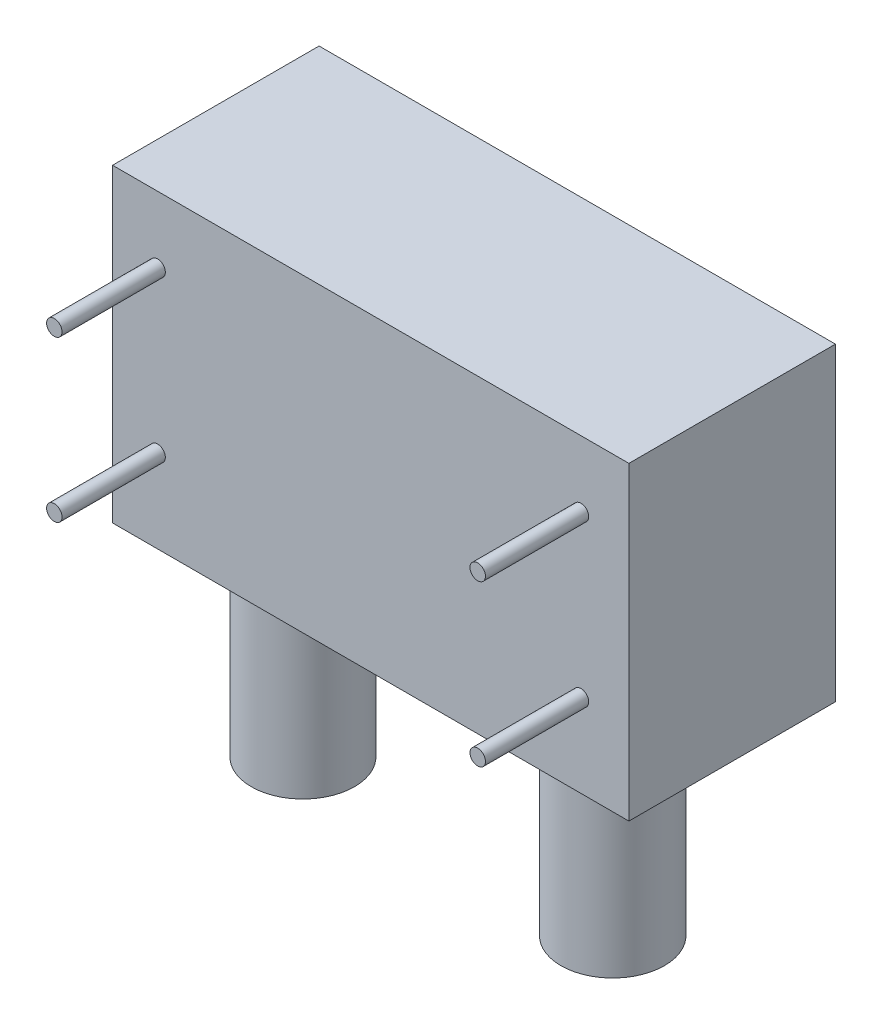
ISO-10303-21;
HEADER;
FILE_DESCRIPTION(('STEP AP214'),'2;1');
FILE_NAME('part.step','',(''),(''),'','','');
FILE_SCHEMA(('AUTOMOTIVE_DESIGN { 1 0 10303 214 1 1 1 1 }'));
ENDSEC;
DATA;
#1=APPLICATION_CONTEXT('core data for automotive mechanical design processes');
#2=APPLICATION_PROTOCOL_DEFINITION('international standard','automotive_design',2000,#1);
#3=PRODUCT_CONTEXT('',#1,'mechanical');
#4=PRODUCT('Part','Part','',(#3));
#5=PRODUCT_RELATED_PRODUCT_CATEGORY('part','',(#4));
#6=PRODUCT_DEFINITION_FORMATION('','',#4);
#7=PRODUCT_DEFINITION_CONTEXT('part definition',#1,'design');
#8=PRODUCT_DEFINITION('design','',#6,#7);
#9=PRODUCT_DEFINITION_SHAPE('','',#8);
#10=(LENGTH_UNIT() NAMED_UNIT(*) SI_UNIT(.MILLI.,.METRE.));
#11=(NAMED_UNIT(*) PLANE_ANGLE_UNIT() SI_UNIT($,.RADIAN.));
#12=(NAMED_UNIT(*) SI_UNIT($,.STERADIAN.) SOLID_ANGLE_UNIT());
#13=UNCERTAINTY_MEASURE_WITH_UNIT(LENGTH_MEASURE(1.E-05),#10,'distance_accuracy_value','');
#14=(GEOMETRIC_REPRESENTATION_CONTEXT(3) GLOBAL_UNCERTAINTY_ASSIGNED_CONTEXT((#13)) GLOBAL_UNIT_ASSIGNED_CONTEXT((#10,
#11,#12)) REPRESENTATION_CONTEXT('',''));
#15=CARTESIAN_POINT('',(0.,0.,0.));
#16=DIRECTION('',(0.,0.,1.));
#17=DIRECTION('',(1.,0.,0.));
#18=AXIS2_PLACEMENT_3D('',#15,#16,#17);
#19=CARTESIAN_POINT('',(-67.3484848484848,46.3330808080808,20.));
#20=DIRECTION('',(-1.,0.,0.));
#21=DIRECTION('',(0.,0.,1.));
#22=AXIS2_PLACEMENT_3D('',#19,#20,#21);
#23=PLANE('',#22);
#24=DIRECTION('',(0.,1.,0.));
#25=VECTOR('',#24,1.);
#26=CARTESIAN_POINT('',(-67.3484848484848,46.3330808080808,0.));
#27=LINE('',#26,#25);
#28=CARTESIAN_POINT('',(-67.3484848484848,16.3330808080808,0.));
#29=VERTEX_POINT('',#28);
#30=CARTESIAN_POINT('',(-67.3484848484848,46.3330808080808,0.));
#31=VERTEX_POINT('',#30);
#32=EDGE_CURVE('E99',#29,#31,#27,.T.);
#33=ORIENTED_EDGE('',*,*,#32,.T.);
#34=DIRECTION('',(0.,0.,-1.));
#35=VECTOR('',#34,1.);
#36=CARTESIAN_POINT('',(-67.3484848484848,46.3330808080808,20.));
#37=LINE('',#36,#35);
#38=CARTESIAN_POINT('',(-67.3484848484848,46.3330808080808,20.));
#39=VERTEX_POINT('',#38);
#40=EDGE_CURVE('E90',#39,#31,#37,.T.);
#41=ORIENTED_EDGE('',*,*,#40,.F.);
#42=DIRECTION('',(0.,1.,0.));
#43=VECTOR('',#42,1.);
#44=CARTESIAN_POINT('',(-67.3484848484848,46.3330808080808,20.));
#45=LINE('',#44,#43);
#46=CARTESIAN_POINT('',(-67.3484848484848,16.3330808080808,20.));
#47=VERTEX_POINT('',#46);
#48=EDGE_CURVE('E84',#47,#39,#45,.T.);
#49=ORIENTED_EDGE('',*,*,#48,.F.);
#50=DIRECTION('',(0.,0.,-1.));
#51=VECTOR('',#50,1.);
#52=CARTESIAN_POINT('',(-67.3484848484848,16.3330808080808,20.));
#53=LINE('',#52,#51);
#54=EDGE_CURVE('E95',#47,#29,#53,.T.);
#55=ORIENTED_EDGE('',*,*,#54,.T.);
#56=EDGE_LOOP('',(#33,#41,#49,#55));
#57=FACE_BOUND('',#56,.T.);
#58=ADVANCED_FACE('F32',(#57),#23,.F.);
#59=CARTESIAN_POINT('',(-117.348484848485,46.3330808080808,20.));
#60=DIRECTION('',(0.,-1.,0.));
#61=DIRECTION('',(0.,0.,-1.));
#62=AXIS2_PLACEMENT_3D('',#59,#60,#61);
#63=PLANE('',#62);
#64=DIRECTION('',(-1.,0.,0.));
#65=VECTOR('',#64,1.);
#66=CARTESIAN_POINT('',(-117.348484848485,46.3330808080808,0.));
#67=LINE('',#66,#65);
#68=CARTESIAN_POINT('',(-117.348484848485,46.3330808080808,0.));
#69=VERTEX_POINT('',#68);
#70=EDGE_CURVE('E89',#31,#69,#67,.T.);
#71=ORIENTED_EDGE('',*,*,#70,.T.);
#72=DIRECTION('',(0.,0.,-1.));
#73=VECTOR('',#72,1.);
#74=CARTESIAN_POINT('',(-117.348484848485,46.3330808080808,20.));
#75=LINE('',#74,#73);
#76=CARTESIAN_POINT('',(-117.348484848485,46.3330808080808,20.));
#77=VERTEX_POINT('',#76);
#78=EDGE_CURVE('E87',#77,#69,#75,.T.);
#79=ORIENTED_EDGE('',*,*,#78,.F.);
#80=DIRECTION('',(-1.,0.,0.));
#81=VECTOR('',#80,1.);
#82=CARTESIAN_POINT('',(-117.348484848485,46.3330808080808,20.));
#83=LINE('',#82,#81);
#84=EDGE_CURVE('E79',#39,#77,#83,.T.);
#85=ORIENTED_EDGE('',*,*,#84,.F.);
#86=ORIENTED_EDGE('',*,*,#40,.T.);
#87=EDGE_LOOP('',(#71,#79,#85,#86));
#88=FACE_BOUND('',#87,.T.);
#89=ADVANCED_FACE('F88',(#88),#63,.F.);
#90=CARTESIAN_POINT('',(-117.348484848485,46.3330808080808,20.));
#91=DIRECTION('',(1.,0.,0.));
#92=DIRECTION('',(0.,0.,-1.));
#93=AXIS2_PLACEMENT_3D('',#90,#91,#92);
#94=PLANE('',#93);
#95=DIRECTION('',(0.,-1.,0.));
#96=VECTOR('',#95,1.);
#97=CARTESIAN_POINT('',(-117.348484848485,46.3330808080808,0.));
#98=LINE('',#97,#96);
#99=CARTESIAN_POINT('',(-117.348484848485,16.3330808080808,0.));
#100=VERTEX_POINT('',#99);
#101=EDGE_CURVE('E65',#69,#100,#98,.T.);
#102=ORIENTED_EDGE('',*,*,#101,.T.);
#103=DIRECTION('',(0.,0.,-1.));
#104=VECTOR('',#103,1.);
#105=CARTESIAN_POINT('',(-117.348484848485,16.3330808080808,20.));
#106=LINE('',#105,#104);
#107=CARTESIAN_POINT('',(-117.348484848485,16.3330808080808,20.));
#108=VERTEX_POINT('',#107);
#109=EDGE_CURVE('E91',#108,#100,#106,.T.);
#110=ORIENTED_EDGE('',*,*,#109,.F.);
#111=DIRECTION('',(0.,-1.,0.));
#112=VECTOR('',#111,1.);
#113=CARTESIAN_POINT('',(-117.348484848485,46.3330808080808,20.));
#114=LINE('',#113,#112);
#115=EDGE_CURVE('E82',#77,#108,#114,.T.);
#116=ORIENTED_EDGE('',*,*,#115,.F.);
#117=ORIENTED_EDGE('',*,*,#78,.T.);
#118=EDGE_LOOP('',(#102,#110,#116,#117));
#119=FACE_BOUND('',#118,.T.);
#120=ADVANCED_FACE('F93',(#119),#94,.F.);
#121=CARTESIAN_POINT('',(-117.348484848485,16.3330808080808,20.));
#122=DIRECTION('',(0.,1.,0.));
#123=DIRECTION('',(0.,0.,1.));
#124=AXIS2_PLACEMENT_3D('',#121,#122,#123);
#125=PLANE('',#124);
#126=CARTESIAN_POINT('',(-78.5127950618032,16.3330808080808,10.4041077553331));
#127=DIRECTION('',(0.,1.,0.));
#128=DIRECTION('',(0.,0.,1.));
#129=AXIS2_PLACEMENT_3D('',#126,#127,#128);
#130=CIRCLE('',#129,5.0155689522019);
#131=CARTESIAN_POINT('',(-78.5127950618032,16.3330808080808,15.419676707535));
#132=VERTEX_POINT('',#131);
#133=EDGE_CURVE('E11',#132,#132,#130,.F.);
#134=ORIENTED_EDGE('',*,*,#133,.F.);
#135=EDGE_LOOP('',(#134));
#136=FACE_BOUND('',#135,.T.);
#137=CARTESIAN_POINT('',(-108.512795061803,16.3330808080808,10.4041077553331));
#138=DIRECTION('',(0.,1.,0.));
#139=DIRECTION('',(0.,0.,1.));
#140=AXIS2_PLACEMENT_3D('',#137,#138,#139);
#141=CIRCLE('',#140,5.);
#142=CARTESIAN_POINT('',(-108.512795061803,16.3330808080808,15.4041077553331));
#143=VERTEX_POINT('',#142);
#144=EDGE_CURVE('E40',#143,#143,#141,.F.);
#145=ORIENTED_EDGE('',*,*,#144,.F.);
#146=EDGE_LOOP('',(#145));
#147=FACE_BOUND('',#146,.T.);
#148=DIRECTION('',(1.,0.,0.));
#149=VECTOR('',#148,1.);
#150=CARTESIAN_POINT('',(-117.348484848485,16.3330808080808,0.));
#151=LINE('',#150,#149);
#152=EDGE_CURVE('E71',#100,#29,#151,.T.);
#153=ORIENTED_EDGE('',*,*,#152,.T.);
#154=ORIENTED_EDGE('',*,*,#54,.F.);
#155=DIRECTION('',(1.,0.,0.));
#156=VECTOR('',#155,1.);
#157=CARTESIAN_POINT('',(-117.348484848485,16.3330808080808,20.));
#158=LINE('',#157,#156);
#159=EDGE_CURVE('E48',#108,#47,#158,.T.);
#160=ORIENTED_EDGE('',*,*,#159,.F.);
#161=ORIENTED_EDGE('',*,*,#109,.T.);
#162=EDGE_LOOP('',(#153,#154,#160,#161));
#163=FACE_BOUND('',#162,.T.);
#164=ADVANCED_FACE('F113',(#136,#147,#163),#125,.F.);
#165=CARTESIAN_POINT('',(0.,0.,20.));
#166=DIRECTION('',(0.,0.,1.));
#167=DIRECTION('',(1.,0.,0.));
#168=AXIS2_PLACEMENT_3D('',#165,#166,#167);
#169=PLANE('',#168);
#170=CARTESIAN_POINT('',(-112.988090360079,24.3858692143711,20.));
#171=DIRECTION('',(0.,0.,1.));
#172=DIRECTION('',(-1.,0.,0.));
#173=AXIS2_PLACEMENT_3D('',#170,#171,#172);
#174=CIRCLE('',#173,0.749999999999999);
#175=CARTESIAN_POINT('',(-113.738090360079,24.3858692143711,20.));
#176=VERTEX_POINT('',#175);
#177=EDGE_CURVE('E191',#176,#176,#174,.T.);
#178=ORIENTED_EDGE('',*,*,#177,.F.);
#179=EDGE_LOOP('',(#178));
#180=FACE_BOUND('',#179,.T.);
#181=CARTESIAN_POINT('',(-71.988091026047,24.3784793977352,20.));
#182=DIRECTION('',(0.,0.,1.));
#183=DIRECTION('',(-1.,0.,0.));
#184=AXIS2_PLACEMENT_3D('',#181,#182,#183);
#185=CIRCLE('',#184,0.749999999999999);
#186=CARTESIAN_POINT('',(-72.738091026047,24.3784793977352,20.));
#187=VERTEX_POINT('',#186);
#188=EDGE_CURVE('E190',#187,#187,#185,.T.);
#189=ORIENTED_EDGE('',*,*,#188,.F.);
#190=EDGE_LOOP('',(#189));
#191=FACE_BOUND('',#190,.T.);
#192=CARTESIAN_POINT('',(-71.9880910260469,39.9155352266076,20.));
#193=DIRECTION('',(0.,0.,1.));
#194=DIRECTION('',(1.,0.,0.));
#195=AXIS2_PLACEMENT_3D('',#192,#193,#194);
#196=CIRCLE('',#195,0.749999999999999);
#197=CARTESIAN_POINT('',(-71.2380910260469,39.9155352266076,20.));
#198=VERTEX_POINT('',#197);
#199=EDGE_CURVE('E200',#198,#198,#196,.T.);
#200=ORIENTED_EDGE('',*,*,#199,.F.);
#201=EDGE_LOOP('',(#200));
#202=FACE_BOUND('',#201,.T.);
#203=CARTESIAN_POINT('',(-112.988090360079,39.9081454099718,20.));
#204=DIRECTION('',(0.,0.,1.));
#205=DIRECTION('',(1.,0.,0.));
#206=AXIS2_PLACEMENT_3D('',#203,#204,#205);
#207=CIRCLE('',#206,0.749999999999999);
#208=CARTESIAN_POINT('',(-112.238090360079,39.9081454099718,20.));
#209=VERTEX_POINT('',#208);
#210=EDGE_CURVE('E205',#209,#209,#207,.T.);
#211=ORIENTED_EDGE('',*,*,#210,.F.);
#212=EDGE_LOOP('',(#211));
#213=FACE_BOUND('',#212,.T.);
#214=ORIENTED_EDGE('',*,*,#48,.T.);
#215=ORIENTED_EDGE('',*,*,#84,.T.);
#216=ORIENTED_EDGE('',*,*,#115,.T.);
#217=ORIENTED_EDGE('',*,*,#159,.T.);
#218=EDGE_LOOP('',(#214,#215,#216,#217));
#219=FACE_BOUND('',#218,.T.);
#220=ADVANCED_FACE('F80',(#180,#191,#202,#213,#219),#169,.T.);
#221=CARTESIAN_POINT('',(0.,0.,0.));
#222=DIRECTION('',(0.,0.,1.));
#223=DIRECTION('',(1.,0.,0.));
#224=AXIS2_PLACEMENT_3D('',#221,#222,#223);
#225=PLANE('',#224);
#226=ORIENTED_EDGE('',*,*,#32,.F.);
#227=ORIENTED_EDGE('',*,*,#152,.F.);
#228=ORIENTED_EDGE('',*,*,#101,.F.);
#229=ORIENTED_EDGE('',*,*,#70,.F.);
#230=EDGE_LOOP('',(#226,#227,#228,#229));
#231=FACE_BOUND('',#230,.T.);
#232=ADVANCED_FACE('F122',(#231),#225,.F.);
#233=CARTESIAN_POINT('',(-108.512795061803,-3.66691919191921,10.4041077553331));
#234=DIRECTION('',(0.,1.,0.));
#235=DIRECTION('',(0.,0.,1.));
#236=AXIS2_PLACEMENT_3D('',#233,#234,#235);
#237=CYLINDRICAL_SURFACE('',#236,5.);
#238=CARTESIAN_POINT('',(-108.512795061803,-3.66691919191921,10.4041077553331));
#239=DIRECTION('',(0.,-1.,0.));
#240=DIRECTION('',(0.,0.,-1.));
#241=AXIS2_PLACEMENT_3D('',#238,#239,#240);
#242=CIRCLE('',#241,5.);
#243=CARTESIAN_POINT('',(-108.512795061803,-3.66691919191921,5.40410775533307));
#244=VERTEX_POINT('',#243);
#245=EDGE_CURVE('E102',#244,#244,#242,.T.);
#246=ORIENTED_EDGE('',*,*,#245,.F.);
#247=EDGE_LOOP('',(#246));
#248=FACE_BOUND('',#247,.T.);
#249=ORIENTED_EDGE('',*,*,#144,.T.);
#250=EDGE_LOOP('',(#249));
#251=FACE_BOUND('',#250,.T.);
#252=ADVANCED_FACE('F111',(#248,#251),#237,.T.);
#253=CARTESIAN_POINT('',(-108.512795061803,-3.66691919191921,10.4041077553331));
#254=DIRECTION('',(0.,-1.,0.));
#255=DIRECTION('',(0.,0.,-1.));
#256=AXIS2_PLACEMENT_3D('',#253,#254,#255);
#257=PLANE('',#256);
#258=ORIENTED_EDGE('',*,*,#245,.T.);
#259=EDGE_LOOP('',(#258));
#260=FACE_BOUND('',#259,.T.);
#261=ADVANCED_FACE('F139',(#260),#257,.T.);
#262=CARTESIAN_POINT('',(-78.5127950618032,-3.66691919191921,10.4041077553331));
#263=DIRECTION('',(0.,1.,0.));
#264=DIRECTION('',(0.,0.,1.));
#265=AXIS2_PLACEMENT_3D('',#262,#263,#264);
#266=CYLINDRICAL_SURFACE('',#265,5.0155689522019);
#267=CARTESIAN_POINT('',(-78.5127950618032,-3.66691919191921,10.4041077553331));
#268=DIRECTION('',(0.,-1.,0.));
#269=DIRECTION('',(0.,0.,-1.));
#270=AXIS2_PLACEMENT_3D('',#267,#268,#269);
#271=CIRCLE('',#270,5.0155689522019);
#272=CARTESIAN_POINT('',(-78.5127950618032,-3.66691919191921,5.38853880313117));
#273=VERTEX_POINT('',#272);
#274=EDGE_CURVE('E211',#273,#273,#271,.T.);
#275=ORIENTED_EDGE('',*,*,#274,.F.);
#276=EDGE_LOOP('',(#275));
#277=FACE_BOUND('',#276,.T.);
#278=ORIENTED_EDGE('',*,*,#133,.T.);
#279=EDGE_LOOP('',(#278));
#280=FACE_BOUND('',#279,.T.);
#281=ADVANCED_FACE('F145',(#277,#280),#266,.T.);
#282=CARTESIAN_POINT('',(-78.5127950618032,-3.66691919191921,10.4041077553331));
#283=DIRECTION('',(0.,-1.,0.));
#284=DIRECTION('',(0.,0.,-1.));
#285=AXIS2_PLACEMENT_3D('',#282,#283,#284);
#286=PLANE('',#285);
#287=ORIENTED_EDGE('',*,*,#274,.T.);
#288=EDGE_LOOP('',(#287));
#289=FACE_BOUND('',#288,.T.);
#290=ADVANCED_FACE('F149',(#289),#286,.T.);
#291=CARTESIAN_POINT('',(-112.988090360079,39.9081454099718,30.));
#292=DIRECTION('',(0.,0.,-1.));
#293=DIRECTION('',(-1.,0.,0.));
#294=AXIS2_PLACEMENT_3D('',#291,#292,#293);
#295=CYLINDRICAL_SURFACE('',#294,0.749999999999999);
#296=CARTESIAN_POINT('',(-112.988090360079,39.9081454099718,30.));
#297=DIRECTION('',(0.,0.,1.));
#298=DIRECTION('',(1.,0.,0.));
#299=AXIS2_PLACEMENT_3D('',#296,#297,#298);
#300=CIRCLE('',#299,0.749999999999999);
#301=CARTESIAN_POINT('',(-112.238090360079,39.9081454099718,30.));
#302=VERTEX_POINT('',#301);
#303=EDGE_CURVE('E208',#302,#302,#300,.T.);
#304=ORIENTED_EDGE('',*,*,#303,.F.);
#305=EDGE_LOOP('',(#304));
#306=FACE_BOUND('',#305,.T.);
#307=ORIENTED_EDGE('',*,*,#210,.T.);
#308=EDGE_LOOP('',(#307));
#309=FACE_BOUND('',#308,.T.);
#310=ADVANCED_FACE('F153',(#306,#309),#295,.T.);
#311=CARTESIAN_POINT('',(-112.988090360079,39.9081454099718,30.));
#312=DIRECTION('',(0.,0.,1.));
#313=DIRECTION('',(1.,0.,0.));
#314=AXIS2_PLACEMENT_3D('',#311,#312,#313);
#315=PLANE('',#314);
#316=ORIENTED_EDGE('',*,*,#303,.T.);
#317=EDGE_LOOP('',(#316));
#318=FACE_BOUND('',#317,.T.);
#319=ADVANCED_FACE('F157',(#318),#315,.T.);
#320=CARTESIAN_POINT('',(-71.9880910260469,39.9155352266076,30.));
#321=DIRECTION('',(0.,0.,-1.));
#322=DIRECTION('',(-1.,0.,0.));
#323=AXIS2_PLACEMENT_3D('',#320,#321,#322);
#324=CYLINDRICAL_SURFACE('',#323,0.749999999999999);
#325=CARTESIAN_POINT('',(-71.9880910260469,39.9155352266076,30.));
#326=DIRECTION('',(0.,0.,1.));
#327=DIRECTION('',(1.,0.,0.));
#328=AXIS2_PLACEMENT_3D('',#325,#326,#327);
#329=CIRCLE('',#328,0.749999999999999);
#330=CARTESIAN_POINT('',(-71.2380910260469,39.9155352266076,30.));
#331=VERTEX_POINT('',#330);
#332=EDGE_CURVE('E202',#331,#331,#329,.T.);
#333=ORIENTED_EDGE('',*,*,#332,.F.);
#334=EDGE_LOOP('',(#333));
#335=FACE_BOUND('',#334,.T.);
#336=ORIENTED_EDGE('',*,*,#199,.T.);
#337=EDGE_LOOP('',(#336));
#338=FACE_BOUND('',#337,.T.);
#339=ADVANCED_FACE('F161',(#335,#338),#324,.T.);
#340=CARTESIAN_POINT('',(-71.9880910260469,39.9155352266076,30.));
#341=DIRECTION('',(0.,0.,1.));
#342=DIRECTION('',(1.,0.,0.));
#343=AXIS2_PLACEMENT_3D('',#340,#341,#342);
#344=PLANE('',#343);
#345=ORIENTED_EDGE('',*,*,#332,.T.);
#346=EDGE_LOOP('',(#345));
#347=FACE_BOUND('',#346,.T.);
#348=ADVANCED_FACE('F165',(#347),#344,.T.);
#349=CARTESIAN_POINT('',(-71.988091026047,24.3784793977352,30.));
#350=DIRECTION('',(0.,0.,-1.));
#351=DIRECTION('',(-1.,0.,0.));
#352=AXIS2_PLACEMENT_3D('',#349,#350,#351);
#353=CYLINDRICAL_SURFACE('',#352,0.749999999999999);
#354=CARTESIAN_POINT('',(-71.988091026047,24.3784793977352,30.));
#355=DIRECTION('',(0.,0.,1.));
#356=DIRECTION('',(-1.,0.,0.));
#357=AXIS2_PLACEMENT_3D('',#354,#355,#356);
#358=CIRCLE('',#357,0.749999999999999);
#359=CARTESIAN_POINT('',(-72.738091026047,24.3784793977352,30.));
#360=VERTEX_POINT('',#359);
#361=EDGE_CURVE('E194',#360,#360,#358,.T.);
#362=ORIENTED_EDGE('',*,*,#361,.F.);
#363=EDGE_LOOP('',(#362));
#364=FACE_BOUND('',#363,.T.);
#365=ORIENTED_EDGE('',*,*,#188,.T.);
#366=EDGE_LOOP('',(#365));
#367=FACE_BOUND('',#366,.T.);
#368=ADVANCED_FACE('F169',(#364,#367),#353,.T.);
#369=CARTESIAN_POINT('',(-71.988091026047,24.3784793977352,30.));
#370=DIRECTION('',(0.,0.,-1.));
#371=DIRECTION('',(-1.,0.,0.));
#372=AXIS2_PLACEMENT_3D('',#369,#370,#371);
#373=PLANE('',#372);
#374=ORIENTED_EDGE('',*,*,#361,.T.);
#375=EDGE_LOOP('',(#374));
#376=FACE_BOUND('',#375,.T.);
#377=ADVANCED_FACE('F173',(#376),#373,.F.);
#378=CARTESIAN_POINT('',(-112.988090360079,24.3858692143711,30.));
#379=DIRECTION('',(0.,0.,-1.));
#380=DIRECTION('',(-1.,0.,0.));
#381=AXIS2_PLACEMENT_3D('',#378,#379,#380);
#382=CYLINDRICAL_SURFACE('',#381,0.749999999999999);
#383=CARTESIAN_POINT('',(-112.988090360079,24.3858692143711,30.));
#384=DIRECTION('',(0.,0.,1.));
#385=DIRECTION('',(-1.,0.,0.));
#386=AXIS2_PLACEMENT_3D('',#383,#384,#385);
#387=CIRCLE('',#386,0.749999999999999);
#388=CARTESIAN_POINT('',(-113.738090360079,24.3858692143711,30.));
#389=VERTEX_POINT('',#388);
#390=EDGE_CURVE('E189',#389,#389,#387,.T.);
#391=ORIENTED_EDGE('',*,*,#390,.F.);
#392=EDGE_LOOP('',(#391));
#393=FACE_BOUND('',#392,.T.);
#394=ORIENTED_EDGE('',*,*,#177,.T.);
#395=EDGE_LOOP('',(#394));
#396=FACE_BOUND('',#395,.T.);
#397=ADVANCED_FACE('F177',(#393,#396),#382,.T.);
#398=CARTESIAN_POINT('',(-112.988090360079,24.3858692143711,30.));
#399=DIRECTION('',(0.,0.,-1.));
#400=DIRECTION('',(-1.,0.,0.));
#401=AXIS2_PLACEMENT_3D('',#398,#399,#400);
#402=PLANE('',#401);
#403=ORIENTED_EDGE('',*,*,#390,.T.);
#404=EDGE_LOOP('',(#403));
#405=FACE_BOUND('',#404,.T.);
#406=ADVANCED_FACE('F181',(#405),#402,.F.);
#407=CLOSED_SHELL('',(#58,#89,#120,#164,#220,#232,#252,#261,#281,#290,#310,#319,#339,#348,#368,
#377,#397,#406));
#408=MANIFOLD_SOLID_BREP('B2',#407);
#409=ADVANCED_BREP_SHAPE_REPRESENTATION('',(#18,#408),#14);
#410=SHAPE_DEFINITION_REPRESENTATION(#9,#409);
ENDSEC;
END-ISO-10303-21;
